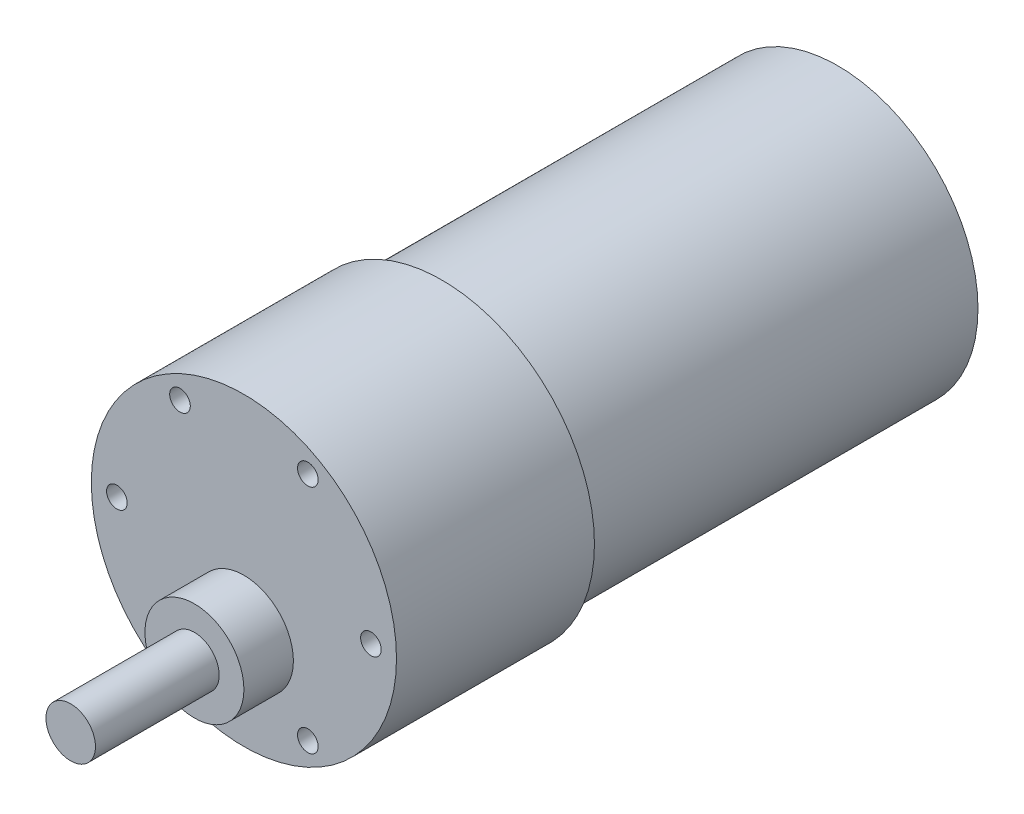
ISO-10303-21;
HEADER;
FILE_DESCRIPTION(('STEP AP214'),'2;1');
FILE_NAME('part.step','',(''),(''),'','','');
FILE_SCHEMA(('AUTOMOTIVE_DESIGN { 1 0 10303 214 1 1 1 1 }'));
ENDSEC;
DATA;
#1=APPLICATION_CONTEXT('core data for automotive mechanical design processes');
#2=APPLICATION_PROTOCOL_DEFINITION('international standard','automotive_design',2000,#1);
#3=PRODUCT_CONTEXT('',#1,'mechanical');
#4=PRODUCT('Part','Part','',(#3));
#5=PRODUCT_RELATED_PRODUCT_CATEGORY('part','',(#4));
#6=PRODUCT_DEFINITION_FORMATION('','',#4);
#7=PRODUCT_DEFINITION_CONTEXT('part definition',#1,'design');
#8=PRODUCT_DEFINITION('design','',#6,#7);
#9=PRODUCT_DEFINITION_SHAPE('','',#8);
#10=(LENGTH_UNIT() NAMED_UNIT(*) SI_UNIT(.MILLI.,.METRE.));
#11=(NAMED_UNIT(*) PLANE_ANGLE_UNIT() SI_UNIT($,.RADIAN.));
#12=(NAMED_UNIT(*) SI_UNIT($,.STERADIAN.) SOLID_ANGLE_UNIT());
#13=UNCERTAINTY_MEASURE_WITH_UNIT(LENGTH_MEASURE(1.E-05),#10,'distance_accuracy_value','');
#14=(GEOMETRIC_REPRESENTATION_CONTEXT(3) GLOBAL_UNCERTAINTY_ASSIGNED_CONTEXT((#13)) GLOBAL_UNIT_ASSIGNED_CONTEXT((#10,
#11,#12)) REPRESENTATION_CONTEXT('',''));
#15=CARTESIAN_POINT('',(0.,0.,0.));
#16=DIRECTION('',(0.,0.,1.));
#17=DIRECTION('',(1.,0.,0.));
#18=AXIS2_PLACEMENT_3D('',#15,#16,#17);
#19=CARTESIAN_POINT('',(0.,0.,48.));
#20=DIRECTION('',(0.,0.,-1.));
#21=DIRECTION('',(-1.,0.,0.));
#22=AXIS2_PLACEMENT_3D('',#19,#20,#21);
#23=CYLINDRICAL_SURFACE('',#22,17.);
#24=CARTESIAN_POINT('',(0.,0.,48.));
#25=DIRECTION('',(0.,0.,1.));
#26=DIRECTION('',(1.,0.,0.));
#27=AXIS2_PLACEMENT_3D('',#24,#25,#26);
#28=CIRCLE('',#27,17.);
#29=CARTESIAN_POINT('',(17.,0.,48.));
#30=VERTEX_POINT('',#29);
#31=EDGE_CURVE('E57',#30,#30,#28,.T.);
#32=ORIENTED_EDGE('',*,*,#31,.F.);
#33=EDGE_LOOP('',(#32));
#34=FACE_BOUND('',#33,.T.);
#35=CARTESIAN_POINT('',(0.,0.,0.));
#36=DIRECTION('',(0.,0.,1.));
#37=DIRECTION('',(1.,0.,0.));
#38=AXIS2_PLACEMENT_3D('',#35,#36,#37);
#39=CIRCLE('',#38,17.);
#40=CARTESIAN_POINT('',(17.,0.,0.));
#41=VERTEX_POINT('',#40);
#42=EDGE_CURVE('E46',#41,#41,#39,.T.);
#43=ORIENTED_EDGE('',*,*,#42,.T.);
#44=EDGE_LOOP('',(#43));
#45=FACE_BOUND('',#44,.T.);
#46=ADVANCED_FACE('F43',(#34,#45),#23,.T.);
#47=CARTESIAN_POINT('',(0.,0.,0.));
#48=DIRECTION('',(0.,0.,1.));
#49=DIRECTION('',(1.,0.,0.));
#50=AXIS2_PLACEMENT_3D('',#47,#48,#49);
#51=PLANE('',#50);
#52=ORIENTED_EDGE('',*,*,#42,.F.);
#53=EDGE_LOOP('',(#52));
#54=FACE_BOUND('',#53,.T.);
#55=ADVANCED_FACE('F83',(#54),#51,.F.);
#56=CARTESIAN_POINT('',(0.,0.,72.));
#57=DIRECTION('',(0.,0.,-1.));
#58=DIRECTION('',(-1.,0.,0.));
#59=AXIS2_PLACEMENT_3D('',#56,#57,#58);
#60=CYLINDRICAL_SURFACE('',#59,18.5);
#61=CARTESIAN_POINT('',(0.,0.,72.));
#62=DIRECTION('',(0.,0.,1.));
#63=DIRECTION('',(1.,0.,0.));
#64=AXIS2_PLACEMENT_3D('',#61,#62,#63);
#65=CIRCLE('',#64,18.5);
#66=CARTESIAN_POINT('',(18.5,0.,72.));
#67=VERTEX_POINT('',#66);
#68=EDGE_CURVE('E68',#67,#67,#65,.T.);
#69=ORIENTED_EDGE('',*,*,#68,.F.);
#70=EDGE_LOOP('',(#69));
#71=FACE_BOUND('',#70,.T.);
#72=CARTESIAN_POINT('',(0.,0.,48.));
#73=DIRECTION('',(0.,0.,1.));
#74=DIRECTION('',(1.,0.,0.));
#75=AXIS2_PLACEMENT_3D('',#72,#73,#74);
#76=CIRCLE('',#75,18.5);
#77=CARTESIAN_POINT('',(18.5,0.,48.));
#78=VERTEX_POINT('',#77);
#79=EDGE_CURVE('E66',#78,#78,#76,.T.);
#80=ORIENTED_EDGE('',*,*,#79,.T.);
#81=EDGE_LOOP('',(#80));
#82=FACE_BOUND('',#81,.T.);
#83=ADVANCED_FACE('F85',(#71,#82),#60,.T.);
#84=CARTESIAN_POINT('',(0.,0.,72.));
#85=DIRECTION('',(0.,0.,1.));
#86=DIRECTION('',(1.,0.,0.));
#87=AXIS2_PLACEMENT_3D('',#84,#85,#86);
#88=PLANE('',#87);
#89=CARTESIAN_POINT('',(-7.74999999999994,14.,72.));
#90=DIRECTION('',(0.,0.,1.));
#91=DIRECTION('',(1.,0.,0.));
#92=AXIS2_PLACEMENT_3D('',#89,#90,#91);
#93=CIRCLE('',#92,1.25);
#94=CARTESIAN_POINT('',(-6.49999999999994,14.,72.));
#95=VERTEX_POINT('',#94);
#96=EDGE_CURVE('E180',#95,#95,#93,.T.);
#97=ORIENTED_EDGE('',*,*,#96,.F.);
#98=EDGE_LOOP('',(#97));
#99=FACE_BOUND('',#98,.T.);
#100=CARTESIAN_POINT('',(15.4,0.,72.));
#101=DIRECTION('',(0.,0.,1.));
#102=DIRECTION('',(1.,0.,0.));
#103=AXIS2_PLACEMENT_3D('',#100,#101,#102);
#104=CIRCLE('',#103,1.25);
#105=CARTESIAN_POINT('',(16.65,0.,72.));
#106=VERTEX_POINT('',#105);
#107=EDGE_CURVE('E184',#106,#106,#104,.T.);
#108=ORIENTED_EDGE('',*,*,#107,.F.);
#109=EDGE_LOOP('',(#108));
#110=FACE_BOUND('',#109,.T.);
#111=CARTESIAN_POINT('',(-15.4,0.,72.));
#112=DIRECTION('',(0.,0.,1.));
#113=DIRECTION('',(1.,0.,0.));
#114=AXIS2_PLACEMENT_3D('',#111,#112,#113);
#115=CIRCLE('',#114,1.25);
#116=CARTESIAN_POINT('',(-14.15,0.,72.));
#117=VERTEX_POINT('',#116);
#118=EDGE_CURVE('E205',#117,#117,#115,.T.);
#119=ORIENTED_EDGE('',*,*,#118,.F.);
#120=EDGE_LOOP('',(#119));
#121=FACE_BOUND('',#120,.T.);
#122=CARTESIAN_POINT('',(7.75000000000005,-14.,72.));
#123=DIRECTION('',(0.,0.,1.));
#124=DIRECTION('',(1.,0.,0.));
#125=AXIS2_PLACEMENT_3D('',#122,#123,#124);
#126=CIRCLE('',#125,1.25);
#127=CARTESIAN_POINT('',(9.00000000000005,-14.,72.));
#128=VERTEX_POINT('',#127);
#129=EDGE_CURVE('E196',#128,#128,#126,.T.);
#130=ORIENTED_EDGE('',*,*,#129,.F.);
#131=EDGE_LOOP('',(#130));
#132=FACE_BOUND('',#131,.T.);
#133=CARTESIAN_POINT('',(7.74999999999995,14.,72.));
#134=DIRECTION('',(0.,0.,1.));
#135=DIRECTION('',(1.,0.,0.));
#136=AXIS2_PLACEMENT_3D('',#133,#134,#135);
#137=CIRCLE('',#136,1.25);
#138=CARTESIAN_POINT('',(8.99999999999995,14.,72.));
#139=VERTEX_POINT('',#138);
#140=EDGE_CURVE('E172',#139,#139,#137,.T.);
#141=ORIENTED_EDGE('',*,*,#140,.F.);
#142=EDGE_LOOP('',(#141));
#143=FACE_BOUND('',#142,.T.);
#144=CARTESIAN_POINT('',(-7.74999999999995,-14.,72.));
#145=DIRECTION('',(0.,0.,1.));
#146=DIRECTION('',(1.,0.,0.));
#147=AXIS2_PLACEMENT_3D('',#144,#145,#146);
#148=CIRCLE('',#147,1.25);
#149=CARTESIAN_POINT('',(-6.49999999999995,-14.,72.));
#150=VERTEX_POINT('',#149);
#151=EDGE_CURVE('E200',#150,#150,#148,.T.);
#152=ORIENTED_EDGE('',*,*,#151,.F.);
#153=EDGE_LOOP('',(#152));
#154=FACE_BOUND('',#153,.T.);
#155=CARTESIAN_POINT('',(0.,-6.5,72.));
#156=DIRECTION('',(0.,0.,1.));
#157=DIRECTION('',(1.,0.,0.));
#158=AXIS2_PLACEMENT_3D('',#155,#156,#157);
#159=CIRCLE('',#158,6.);
#160=CARTESIAN_POINT('',(6.,-6.5,72.));
#161=VERTEX_POINT('',#160);
#162=EDGE_CURVE('E51',#161,#161,#159,.T.);
#163=ORIENTED_EDGE('',*,*,#162,.F.);
#164=EDGE_LOOP('',(#163));
#165=FACE_BOUND('',#164,.T.);
#166=ORIENTED_EDGE('',*,*,#68,.T.);
#167=EDGE_LOOP('',(#166));
#168=FACE_BOUND('',#167,.T.);
#169=ADVANCED_FACE('F90',(#99,#110,#121,#132,#143,#154,#165,#168),#88,.T.);
#170=CARTESIAN_POINT('',(0.,0.,48.));
#171=DIRECTION('',(0.,0.,1.));
#172=DIRECTION('',(1.,0.,0.));
#173=AXIS2_PLACEMENT_3D('',#170,#171,#172);
#174=PLANE('',#173);
#175=ORIENTED_EDGE('',*,*,#31,.T.);
#176=EDGE_LOOP('',(#175));
#177=FACE_BOUND('',#176,.T.);
#178=ORIENTED_EDGE('',*,*,#79,.F.);
#179=EDGE_LOOP('',(#178));
#180=FACE_BOUND('',#179,.T.);
#181=ADVANCED_FACE('F95',(#177,#180),#174,.F.);
#182=CARTESIAN_POINT('',(0.,-6.5,78.));
#183=DIRECTION('',(0.,0.,-1.));
#184=DIRECTION('',(-1.,0.,0.));
#185=AXIS2_PLACEMENT_3D('',#182,#183,#184);
#186=CYLINDRICAL_SURFACE('',#185,6.);
#187=CARTESIAN_POINT('',(0.,-6.5,78.));
#188=DIRECTION('',(0.,0.,1.));
#189=DIRECTION('',(1.,0.,0.));
#190=AXIS2_PLACEMENT_3D('',#187,#188,#189);
#191=CIRCLE('',#190,6.);
#192=CARTESIAN_POINT('',(6.,-6.5,78.));
#193=VERTEX_POINT('',#192);
#194=EDGE_CURVE('E63',#193,#193,#191,.T.);
#195=ORIENTED_EDGE('',*,*,#194,.F.);
#196=EDGE_LOOP('',(#195));
#197=FACE_BOUND('',#196,.T.);
#198=ORIENTED_EDGE('',*,*,#162,.T.);
#199=EDGE_LOOP('',(#198));
#200=FACE_BOUND('',#199,.T.);
#201=ADVANCED_FACE('F98',(#197,#200),#186,.T.);
#202=CARTESIAN_POINT('',(0.,-6.5,78.));
#203=DIRECTION('',(0.,0.,1.));
#204=DIRECTION('',(1.,0.,0.));
#205=AXIS2_PLACEMENT_3D('',#202,#203,#204);
#206=PLANE('',#205);
#207=CARTESIAN_POINT('',(0.,-6.5,78.));
#208=DIRECTION('',(0.,0.,1.));
#209=DIRECTION('',(1.,0.,0.));
#210=AXIS2_PLACEMENT_3D('',#207,#208,#209);
#211=CIRCLE('',#210,3.);
#212=CARTESIAN_POINT('',(3.,-6.5,78.));
#213=VERTEX_POINT('',#212);
#214=EDGE_CURVE('E10',#213,#213,#211,.T.);
#215=ORIENTED_EDGE('',*,*,#214,.F.);
#216=EDGE_LOOP('',(#215));
#217=FACE_BOUND('',#216,.T.);
#218=ORIENTED_EDGE('',*,*,#194,.T.);
#219=EDGE_LOOP('',(#218));
#220=FACE_BOUND('',#219,.T.);
#221=ADVANCED_FACE('F104',(#217,#220),#206,.T.);
#222=CARTESIAN_POINT('',(0.,-6.5,93.));
#223=DIRECTION('',(0.,0.,-1.));
#224=DIRECTION('',(-1.,0.,0.));
#225=AXIS2_PLACEMENT_3D('',#222,#223,#224);
#226=CYLINDRICAL_SURFACE('',#225,3.);
#227=CARTESIAN_POINT('',(0.,-6.5,93.));
#228=DIRECTION('',(0.,0.,1.));
#229=DIRECTION('',(1.,0.,0.));
#230=AXIS2_PLACEMENT_3D('',#227,#228,#229);
#231=CIRCLE('',#230,3.);
#232=CARTESIAN_POINT('',(3.,-6.5,93.));
#233=VERTEX_POINT('',#232);
#234=EDGE_CURVE('E61',#233,#233,#231,.T.);
#235=ORIENTED_EDGE('',*,*,#234,.F.);
#236=EDGE_LOOP('',(#235));
#237=FACE_BOUND('',#236,.T.);
#238=ORIENTED_EDGE('',*,*,#214,.T.);
#239=EDGE_LOOP('',(#238));
#240=FACE_BOUND('',#239,.T.);
#241=ADVANCED_FACE('F108',(#237,#240),#226,.T.);
#242=CARTESIAN_POINT('',(0.,-6.5,93.));
#243=DIRECTION('',(0.,0.,1.));
#244=DIRECTION('',(1.,0.,0.));
#245=AXIS2_PLACEMENT_3D('',#242,#243,#244);
#246=PLANE('',#245);
#247=ORIENTED_EDGE('',*,*,#234,.T.);
#248=EDGE_LOOP('',(#247));
#249=FACE_BOUND('',#248,.T.);
#250=ADVANCED_FACE('F112',(#249),#246,.T.);
#251=CARTESIAN_POINT('',(-7.74999999999995,-14.,58.));
#252=DIRECTION('',(0.,0.,1.));
#253=DIRECTION('',(1.,0.,0.));
#254=AXIS2_PLACEMENT_3D('',#251,#252,#253);
#255=CYLINDRICAL_SURFACE('',#254,1.25);
#256=CARTESIAN_POINT('',(-7.74999999999995,-14.,58.));
#257=DIRECTION('',(0.,0.,1.));
#258=DIRECTION('',(1.,0.,0.));
#259=AXIS2_PLACEMENT_3D('',#256,#257,#258);
#260=CIRCLE('',#259,1.25);
#261=CARTESIAN_POINT('',(-6.49999999999995,-14.,58.));
#262=VERTEX_POINT('',#261);
#263=EDGE_CURVE('E212',#262,#262,#260,.T.);
#264=ORIENTED_EDGE('',*,*,#263,.F.);
#265=EDGE_LOOP('',(#264));
#266=FACE_BOUND('',#265,.T.);
#267=ORIENTED_EDGE('',*,*,#151,.T.);
#268=EDGE_LOOP('',(#267));
#269=FACE_BOUND('',#268,.T.);
#270=ADVANCED_FACE('F116',(#266,#269),#255,.F.);
#271=CARTESIAN_POINT('',(-7.74999999999995,-14.,58.));
#272=DIRECTION('',(0.,0.,1.));
#273=DIRECTION('',(1.,0.,0.));
#274=AXIS2_PLACEMENT_3D('',#271,#272,#273);
#275=PLANE('',#274);
#276=ORIENTED_EDGE('',*,*,#263,.T.);
#277=EDGE_LOOP('',(#276));
#278=FACE_BOUND('',#277,.T.);
#279=ADVANCED_FACE('F120',(#278),#275,.T.);
#280=CARTESIAN_POINT('',(7.74999999999995,14.,58.));
#281=DIRECTION('',(0.,0.,1.));
#282=DIRECTION('',(1.,0.,0.));
#283=AXIS2_PLACEMENT_3D('',#280,#281,#282);
#284=CYLINDRICAL_SURFACE('',#283,1.25);
#285=CARTESIAN_POINT('',(7.74999999999995,14.,58.));
#286=DIRECTION('',(0.,0.,1.));
#287=DIRECTION('',(1.,0.,0.));
#288=AXIS2_PLACEMENT_3D('',#285,#286,#287);
#289=CIRCLE('',#288,1.25);
#290=CARTESIAN_POINT('',(8.99999999999995,14.,58.));
#291=VERTEX_POINT('',#290);
#292=EDGE_CURVE('E169',#291,#291,#289,.T.);
#293=ORIENTED_EDGE('',*,*,#292,.F.);
#294=EDGE_LOOP('',(#293));
#295=FACE_BOUND('',#294,.T.);
#296=ORIENTED_EDGE('',*,*,#140,.T.);
#297=EDGE_LOOP('',(#296));
#298=FACE_BOUND('',#297,.T.);
#299=ADVANCED_FACE('F124',(#295,#298),#284,.F.);
#300=CARTESIAN_POINT('',(7.74999999999995,14.,58.));
#301=DIRECTION('',(0.,0.,1.));
#302=DIRECTION('',(1.,0.,0.));
#303=AXIS2_PLACEMENT_3D('',#300,#301,#302);
#304=PLANE('',#303);
#305=ORIENTED_EDGE('',*,*,#292,.T.);
#306=EDGE_LOOP('',(#305));
#307=FACE_BOUND('',#306,.T.);
#308=ADVANCED_FACE('F142',(#307),#304,.T.);
#309=CARTESIAN_POINT('',(7.75000000000005,-14.,58.));
#310=DIRECTION('',(0.,0.,1.));
#311=DIRECTION('',(1.,0.,0.));
#312=AXIS2_PLACEMENT_3D('',#309,#310,#311);
#313=CYLINDRICAL_SURFACE('',#312,1.25);
#314=CARTESIAN_POINT('',(7.75000000000005,-14.,58.));
#315=DIRECTION('',(0.,0.,1.));
#316=DIRECTION('',(1.,0.,0.));
#317=AXIS2_PLACEMENT_3D('',#314,#315,#316);
#318=CIRCLE('',#317,1.25);
#319=CARTESIAN_POINT('',(9.00000000000005,-14.,58.));
#320=VERTEX_POINT('',#319);
#321=EDGE_CURVE('E201',#320,#320,#318,.T.);
#322=ORIENTED_EDGE('',*,*,#321,.F.);
#323=EDGE_LOOP('',(#322));
#324=FACE_BOUND('',#323,.T.);
#325=ORIENTED_EDGE('',*,*,#129,.T.);
#326=EDGE_LOOP('',(#325));
#327=FACE_BOUND('',#326,.T.);
#328=ADVANCED_FACE('F138',(#324,#327),#313,.F.);
#329=CARTESIAN_POINT('',(7.75000000000005,-14.,58.));
#330=DIRECTION('',(0.,0.,1.));
#331=DIRECTION('',(1.,0.,0.));
#332=AXIS2_PLACEMENT_3D('',#329,#330,#331);
#333=PLANE('',#332);
#334=ORIENTED_EDGE('',*,*,#321,.T.);
#335=EDGE_LOOP('',(#334));
#336=FACE_BOUND('',#335,.T.);
#337=ADVANCED_FACE('F134',(#336),#333,.T.);
#338=CARTESIAN_POINT('',(-15.4,0.,58.));
#339=DIRECTION('',(0.,0.,1.));
#340=DIRECTION('',(1.,0.,0.));
#341=AXIS2_PLACEMENT_3D('',#338,#339,#340);
#342=CYLINDRICAL_SURFACE('',#341,1.25);
#343=CARTESIAN_POINT('',(-15.4,0.,58.));
#344=DIRECTION('',(0.,0.,1.));
#345=DIRECTION('',(1.,0.,0.));
#346=AXIS2_PLACEMENT_3D('',#343,#344,#345);
#347=CIRCLE('',#346,1.25);
#348=CARTESIAN_POINT('',(-14.15,0.,58.));
#349=VERTEX_POINT('',#348);
#350=EDGE_CURVE('E188',#349,#349,#347,.T.);
#351=ORIENTED_EDGE('',*,*,#350,.F.);
#352=EDGE_LOOP('',(#351));
#353=FACE_BOUND('',#352,.T.);
#354=ORIENTED_EDGE('',*,*,#118,.T.);
#355=EDGE_LOOP('',(#354));
#356=FACE_BOUND('',#355,.T.);
#357=ADVANCED_FACE('F130',(#353,#356),#342,.F.);
#358=CARTESIAN_POINT('',(-15.4,0.,58.));
#359=DIRECTION('',(0.,0.,1.));
#360=DIRECTION('',(1.,0.,0.));
#361=AXIS2_PLACEMENT_3D('',#358,#359,#360);
#362=PLANE('',#361);
#363=ORIENTED_EDGE('',*,*,#350,.T.);
#364=EDGE_LOOP('',(#363));
#365=FACE_BOUND('',#364,.T.);
#366=ADVANCED_FACE('F126',(#365),#362,.T.);
#367=CARTESIAN_POINT('',(15.4,0.,58.));
#368=DIRECTION('',(0.,0.,1.));
#369=DIRECTION('',(1.,0.,0.));
#370=AXIS2_PLACEMENT_3D('',#367,#368,#369);
#371=CYLINDRICAL_SURFACE('',#370,1.25);
#372=CARTESIAN_POINT('',(15.4,0.,58.));
#373=DIRECTION('',(0.,0.,1.));
#374=DIRECTION('',(1.,0.,0.));
#375=AXIS2_PLACEMENT_3D('',#372,#373,#374);
#376=CIRCLE('',#375,1.25);
#377=CARTESIAN_POINT('',(16.65,0.,58.));
#378=VERTEX_POINT('',#377);
#379=EDGE_CURVE('E189',#378,#378,#376,.T.);
#380=ORIENTED_EDGE('',*,*,#379,.F.);
#381=EDGE_LOOP('',(#380));
#382=FACE_BOUND('',#381,.T.);
#383=ORIENTED_EDGE('',*,*,#107,.T.);
#384=EDGE_LOOP('',(#383));
#385=FACE_BOUND('',#384,.T.);
#386=ADVANCED_FACE('F129',(#382,#385),#371,.F.);
#387=CARTESIAN_POINT('',(15.4,0.,58.));
#388=DIRECTION('',(0.,0.,1.));
#389=DIRECTION('',(1.,0.,0.));
#390=AXIS2_PLACEMENT_3D('',#387,#388,#389);
#391=PLANE('',#390);
#392=ORIENTED_EDGE('',*,*,#379,.T.);
#393=EDGE_LOOP('',(#392));
#394=FACE_BOUND('',#393,.T.);
#395=ADVANCED_FACE('F151',(#394),#391,.T.);
#396=CARTESIAN_POINT('',(-7.74999999999994,14.,58.));
#397=DIRECTION('',(0.,0.,1.));
#398=DIRECTION('',(1.,0.,0.));
#399=AXIS2_PLACEMENT_3D('',#396,#397,#398);
#400=CYLINDRICAL_SURFACE('',#399,1.25);
#401=CARTESIAN_POINT('',(-7.74999999999994,14.,58.));
#402=DIRECTION('',(0.,0.,1.));
#403=DIRECTION('',(1.,0.,0.));
#404=AXIS2_PLACEMENT_3D('',#401,#402,#403);
#405=CIRCLE('',#404,1.25);
#406=CARTESIAN_POINT('',(-6.49999999999994,14.,58.));
#407=VERTEX_POINT('',#406);
#408=EDGE_CURVE('E175',#407,#407,#405,.T.);
#409=ORIENTED_EDGE('',*,*,#408,.F.);
#410=EDGE_LOOP('',(#409));
#411=FACE_BOUND('',#410,.T.);
#412=ORIENTED_EDGE('',*,*,#96,.T.);
#413=EDGE_LOOP('',(#412));
#414=FACE_BOUND('',#413,.T.);
#415=ADVANCED_FACE('F147',(#411,#414),#400,.F.);
#416=CARTESIAN_POINT('',(-7.74999999999994,14.,58.));
#417=DIRECTION('',(0.,0.,1.));
#418=DIRECTION('',(1.,0.,0.));
#419=AXIS2_PLACEMENT_3D('',#416,#417,#418);
#420=PLANE('',#419);
#421=ORIENTED_EDGE('',*,*,#408,.T.);
#422=EDGE_LOOP('',(#421));
#423=FACE_BOUND('',#422,.T.);
#424=ADVANCED_FACE('F144',(#423),#420,.T.);
#425=CLOSED_SHELL('',(#46,#55,#83,#169,#181,#201,#221,#241,#250,#270,#279,#299,#308,#328,#337,
#357,#366,#386,#395,#415,#424));
#426=MANIFOLD_SOLID_BREP('B2',#425);
#427=ADVANCED_BREP_SHAPE_REPRESENTATION('',(#18,#426),#14);
#428=SHAPE_DEFINITION_REPRESENTATION(#9,#427);
ENDSEC;
END-ISO-10303-21;
